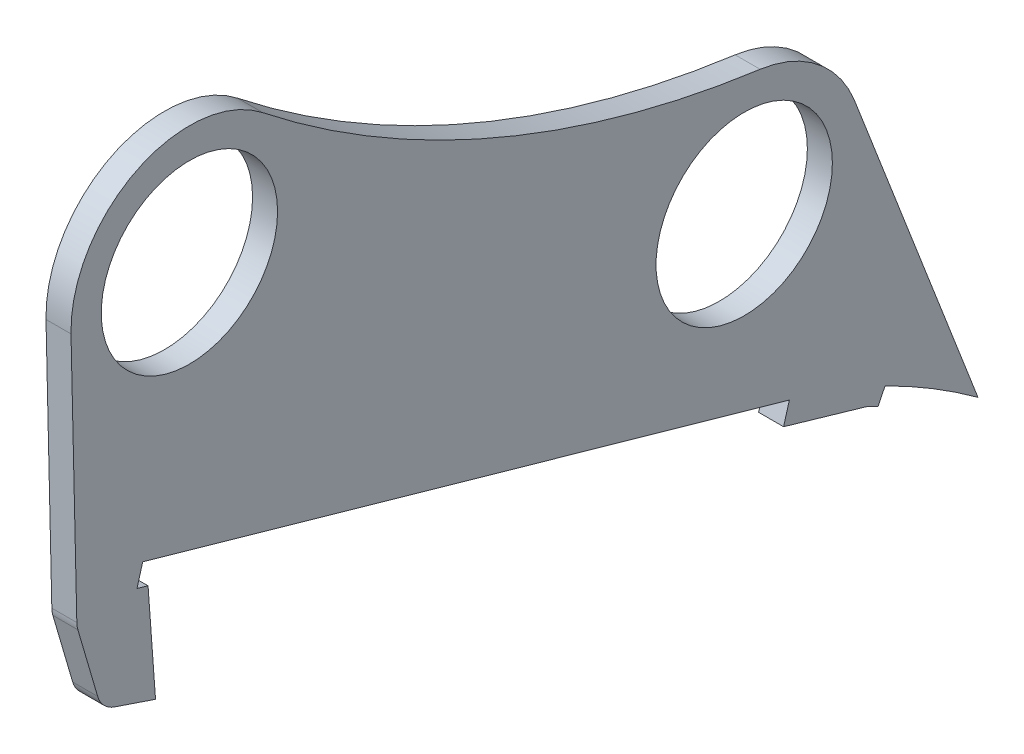
ISO-10303-21;
HEADER;
FILE_DESCRIPTION(('STEP AP214'),'2;1');
FILE_NAME('part.step','',(''),(''),'','','');
FILE_SCHEMA(('AUTOMOTIVE_DESIGN { 1 0 10303 214 1 1 1 1 }'));
ENDSEC;
DATA;
#1=APPLICATION_CONTEXT('core data for automotive mechanical design processes');
#2=APPLICATION_PROTOCOL_DEFINITION('international standard','automotive_design',2000,#1);
#3=PRODUCT_CONTEXT('',#1,'mechanical');
#4=PRODUCT('Part','Part','',(#3));
#5=PRODUCT_RELATED_PRODUCT_CATEGORY('part','',(#4));
#6=PRODUCT_DEFINITION_FORMATION('','',#4);
#7=PRODUCT_DEFINITION_CONTEXT('part definition',#1,'design');
#8=PRODUCT_DEFINITION('design','',#6,#7);
#9=PRODUCT_DEFINITION_SHAPE('','',#8);
#10=(LENGTH_UNIT() NAMED_UNIT(*) SI_UNIT(.MILLI.,.METRE.));
#11=(NAMED_UNIT(*) PLANE_ANGLE_UNIT() SI_UNIT($,.RADIAN.));
#12=(NAMED_UNIT(*) SI_UNIT($,.STERADIAN.) SOLID_ANGLE_UNIT());
#13=UNCERTAINTY_MEASURE_WITH_UNIT(LENGTH_MEASURE(1.E-05),#10,'distance_accuracy_value','');
#14=(GEOMETRIC_REPRESENTATION_CONTEXT(3) GLOBAL_UNCERTAINTY_ASSIGNED_CONTEXT((#13)) GLOBAL_UNIT_ASSIGNED_CONTEXT((#10,
#11,#12)) REPRESENTATION_CONTEXT('',''));
#15=CARTESIAN_POINT('',(0.,0.,0.));
#16=DIRECTION('',(0.,0.,1.));
#17=DIRECTION('',(1.,0.,0.));
#18=AXIS2_PLACEMENT_3D('',#15,#16,#17);
#19=CARTESIAN_POINT('',(-191.,906.438641209592,-119.844436372068));
#20=DIRECTION('',(0.,-0.947327251678291,0.320267198176234));
#21=DIRECTION('',(0.,-0.320267198176234,-0.947327251678291));
#22=AXIS2_PLACEMENT_3D('',#19,#20,#21);
#23=PLANE('',#22);
#24=DIRECTION('',(0.,-0.320267198176234,-0.947327251678291));
#25=VECTOR('',#24,1.);
#26=CARTESIAN_POINT('',(-210.,906.438641209592,-119.844436372068));
#27=LINE('',#26,#25);
#28=CARTESIAN_POINT('',(-210.,916.975114147196,-88.6783100650255));
#29=VERTEX_POINT('',#28);
#30=CARTESIAN_POINT('',(-210.,906.438641209592,-119.844436372068));
#31=VERTEX_POINT('',#30);
#32=EDGE_CURVE('E229',#29,#31,#27,.T.);
#33=ORIENTED_EDGE('',*,*,#32,.T.);
#34=DIRECTION('',(-1.,0.,0.));
#35=VECTOR('',#34,1.);
#36=CARTESIAN_POINT('',(-191.,906.438641209592,-119.844436372068));
#37=LINE('',#36,#35);
#38=CARTESIAN_POINT('',(-191.,906.438641209592,-119.844436372068));
#39=VERTEX_POINT('',#38);
#40=EDGE_CURVE('E195',#39,#31,#37,.T.);
#41=ORIENTED_EDGE('',*,*,#40,.F.);
#42=DIRECTION('',(0.,-0.320267198176234,-0.947327251678291));
#43=VECTOR('',#42,1.);
#44=CARTESIAN_POINT('',(-191.,906.438641209592,-119.844436372068));
#45=LINE('',#44,#43);
#46=CARTESIAN_POINT('',(-191.,916.975114147196,-88.6783100650255));
#47=VERTEX_POINT('',#46);
#48=EDGE_CURVE('E257',#47,#39,#45,.T.);
#49=ORIENTED_EDGE('',*,*,#48,.F.);
#50=DIRECTION('',(-1.,0.,0.));
#51=VECTOR('',#50,1.);
#52=CARTESIAN_POINT('',(-191.,916.975114147196,-88.6783100650255));
#53=LINE('',#52,#51);
#54=EDGE_CURVE('E204',#29,#47,#53,.F.);
#55=ORIENTED_EDGE('',*,*,#54,.F.);
#56=EDGE_LOOP('',(#33,#41,#49,#55));
#57=FACE_BOUND('',#56,.T.);
#58=ADVANCED_FACE('F37',(#57),#23,.T.);
#59=CARTESIAN_POINT('',(-191.,920.309525162057,-78.8153629987563));
#60=DIRECTION('',(0.,-0.281017058971093,0.959702773033004));
#61=DIRECTION('',(0.,-0.959702773033004,-0.281017058971093));
#62=AXIS2_PLACEMENT_3D('',#59,#60,#61);
#63=PLANE('',#62);
#64=DIRECTION('',(0.,-0.959702773033004,-0.281017058971093));
#65=VECTOR('',#64,1.);
#66=CARTESIAN_POINT('',(-191.,920.309525162057,-78.8153629987563));
#67=LINE('',#66,#65);
#68=CARTESIAN_POINT('',(-191.,981.661449624326,-60.8504911039759));
#69=VERTEX_POINT('',#68);
#70=CARTESIAN_POINT('',(-191.,930.30131800134,-75.8895985678901));
#71=VERTEX_POINT('',#70);
#72=EDGE_CURVE('E216',#69,#71,#67,.T.);
#73=ORIENTED_EDGE('',*,*,#72,.F.);
#74=DIRECTION('',(-1.,0.,0.));
#75=VECTOR('',#74,1.);
#76=CARTESIAN_POINT('',(-191.,981.661449624326,-60.8504911039759));
#77=LINE('',#76,#75);
#78=CARTESIAN_POINT('',(-210.,981.661449624326,-60.8504911039759));
#79=VERTEX_POINT('',#78);
#80=EDGE_CURVE('E186',#79,#69,#77,.F.);
#81=ORIENTED_EDGE('',*,*,#80,.F.);
#82=DIRECTION('',(0.,-0.959702773033004,-0.281017058971093));
#83=VECTOR('',#82,1.);
#84=CARTESIAN_POINT('',(-210.,920.309525162057,-78.8153629987563));
#85=LINE('',#84,#83);
#86=CARTESIAN_POINT('',(-210.,930.30131800134,-75.8895985678901));
#87=VERTEX_POINT('',#86);
#88=EDGE_CURVE('E217',#79,#87,#85,.T.);
#89=ORIENTED_EDGE('',*,*,#88,.T.);
#90=DIRECTION('',(-1.,0.,0.));
#91=VECTOR('',#90,1.);
#92=CARTESIAN_POINT('',(-191.,930.30131800134,-75.8895985678901));
#93=LINE('',#92,#91);
#94=EDGE_CURVE('E189',#71,#87,#93,.T.);
#95=ORIENTED_EDGE('',*,*,#94,.F.);
#96=EDGE_LOOP('',(#73,#81,#89,#95));
#97=FACE_BOUND('',#96,.T.);
#98=ADVANCED_FACE('F214',(#97),#63,.T.);
#99=CARTESIAN_POINT('',(-191.,984.188394964553,-60.1105591504117));
#100=DIRECTION('',(0.,-0.0230522795893329,0.999734260894231));
#101=DIRECTION('',(0.,-0.999734260894231,-0.0230522795893329));
#102=AXIS2_PLACEMENT_3D('',#99,#100,#101);
#103=PLANE('',#102);
#104=DIRECTION('',(0.,-0.999734260894231,-0.0230522795893329));
#105=VECTOR('',#104,1.);
#106=CARTESIAN_POINT('',(-191.,984.188394964553,-60.1105591504117));
#107=LINE('',#106,#105);
#108=CARTESIAN_POINT('',(-191.,1179.01810732901,-55.618096325623));
#109=VERTEX_POINT('',#108);
#110=CARTESIAN_POINT('',(-191.,986.820745211961,-60.0498613467513));
#111=VERTEX_POINT('',#110);
#112=EDGE_CURVE('E221',#109,#111,#107,.T.);
#113=ORIENTED_EDGE('',*,*,#112,.F.);
#114=DIRECTION('',(-1.,0.,0.));
#115=VECTOR('',#114,1.);
#116=CARTESIAN_POINT('',(-191.,1179.01810732901,-55.618096325623));
#117=LINE('',#116,#115);
#118=CARTESIAN_POINT('',(-210.,1179.01810732901,-55.618096325623));
#119=VERTEX_POINT('',#118);
#120=EDGE_CURVE('E187',#109,#119,#117,.T.);
#121=ORIENTED_EDGE('',*,*,#120,.T.);
#122=DIRECTION('',(0.,-0.999734260894231,-0.0230522795893329));
#123=VECTOR('',#122,1.);
#124=CARTESIAN_POINT('',(-210.,984.188394964553,-60.1105591504117));
#125=LINE('',#124,#123);
#126=CARTESIAN_POINT('',(-210.,986.820745211961,-60.0498613467513));
#127=VERTEX_POINT('',#126);
#128=EDGE_CURVE('E254',#119,#127,#125,.T.);
#129=ORIENTED_EDGE('',*,*,#128,.T.);
#130=DIRECTION('',(-1.,0.,0.));
#131=VECTOR('',#130,1.);
#132=CARTESIAN_POINT('',(-191.,986.820745211961,-60.0498613467513));
#133=LINE('',#132,#131);
#134=EDGE_CURVE('E11',#111,#127,#133,.T.);
#135=ORIENTED_EDGE('',*,*,#134,.F.);
#136=EDGE_LOOP('',(#113,#121,#129,#135));
#137=FACE_BOUND('',#136,.T.);
#138=ADVANCED_FACE('F331',(#137),#103,.T.);
#139=CARTESIAN_POINT('',(-191.,1181.09281249205,-145.594179806104));
#140=DIRECTION('',(-1.,0.,0.));
#141=DIRECTION('',(0.,0.,-1.));
#142=AXIS2_PLACEMENT_3D('',#139,#140,#141);
#143=CYLINDRICAL_SURFACE('',#142,90.0000000000002);
#144=CARTESIAN_POINT('',(-210.,1181.09281249205,-145.594179806104));
#145=DIRECTION('',(1.,0.,0.));
#146=DIRECTION('',(0.,0.,1.));
#147=AXIS2_PLACEMENT_3D('',#144,#145,#146);
#148=CIRCLE('',#147,90.0000000000002);
#149=CARTESIAN_POINT('',(-210.,1251.75226940095,-201.336812945738));
#150=VERTEX_POINT('',#149);
#151=EDGE_CURVE('E252',#150,#119,#148,.T.);
#152=ORIENTED_EDGE('',*,*,#151,.T.);
#153=ORIENTED_EDGE('',*,*,#120,.F.);
#154=CARTESIAN_POINT('',(-191.,1181.09281249205,-145.594179806104));
#155=DIRECTION('',(1.,0.,0.));
#156=DIRECTION('',(0.,0.,1.));
#157=AXIS2_PLACEMENT_3D('',#154,#155,#156);
#158=CIRCLE('',#157,90.0000000000002);
#159=CARTESIAN_POINT('',(-191.,1251.75226940095,-201.336812945738));
#160=VERTEX_POINT('',#159);
#161=EDGE_CURVE('E225',#160,#109,#158,.T.);
#162=ORIENTED_EDGE('',*,*,#161,.F.);
#163=DIRECTION('',(-1.,0.,0.));
#164=VECTOR('',#163,1.);
#165=CARTESIAN_POINT('',(-191.,1251.75226940095,-201.336812945738));
#166=LINE('',#165,#164);
#167=EDGE_CURVE('E192',#160,#150,#166,.T.);
#168=ORIENTED_EDGE('',*,*,#167,.T.);
#169=EDGE_LOOP('',(#152,#153,#162,#168));
#170=FACE_BOUND('',#169,.T.);
#171=ADVANCED_FACE('F327',(#170),#143,.T.);
#172=CARTESIAN_POINT('',(-191.,1863.76364397971,-684.147281959295));
#173=DIRECTION('',(-1.,0.,0.));
#174=DIRECTION('',(0.,0.,-1.));
#175=AXIS2_PLACEMENT_3D('',#172,#173,#174);
#176=CYLINDRICAL_SURFACE('',#175,779.52798);
#177=CARTESIAN_POINT('',(-210.,1863.76364397971,-684.147281959295));
#178=DIRECTION('',(-1.,0.,0.));
#179=DIRECTION('',(0.,0.,1.));
#180=AXIS2_PLACEMENT_3D('',#177,#178,#179);
#181=CIRCLE('',#180,779.52798);
#182=CARTESIAN_POINT('',(-210.,1091.32003343083,-579.291475610333));
#183=VERTEX_POINT('',#182);
#184=EDGE_CURVE('E250',#183,#150,#181,.T.);
#185=ORIENTED_EDGE('',*,*,#184,.T.);
#186=ORIENTED_EDGE('',*,*,#167,.F.);
#187=CARTESIAN_POINT('',(-191.,1863.76364397971,-684.147281959295));
#188=DIRECTION('',(-1.,0.,0.));
#189=DIRECTION('',(0.,0.,1.));
#190=AXIS2_PLACEMENT_3D('',#187,#188,#189);
#191=CIRCLE('',#190,779.52798);
#192=CARTESIAN_POINT('',(-191.,1091.32003343083,-579.291475610333));
#193=VERTEX_POINT('',#192);
#194=EDGE_CURVE('E320',#193,#160,#191,.T.);
#195=ORIENTED_EDGE('',*,*,#194,.F.);
#196=DIRECTION('',(-1.,0.,0.));
#197=VECTOR('',#196,1.);
#198=CARTESIAN_POINT('',(-191.,1091.32003343083,-579.291475610333));
#199=LINE('',#198,#197);
#200=EDGE_CURVE('E261',#193,#183,#199,.T.);
#201=ORIENTED_EDGE('',*,*,#200,.T.);
#202=EDGE_LOOP('',(#185,#186,#195,#201));
#203=FACE_BOUND('',#202,.T.);
#204=ADVANCED_FACE('F381',(#203),#176,.F.);
#205=CARTESIAN_POINT('',(-191.,1002.13795564397,-567.185402687323));
#206=DIRECTION('',(-1.,0.,0.));
#207=DIRECTION('',(0.,0.,-1.));
#208=AXIS2_PLACEMENT_3D('',#205,#206,#207);
#209=CYLINDRICAL_SURFACE('',#208,90.);
#210=CARTESIAN_POINT('',(-210.,1002.13795564397,-567.185402687323));
#211=DIRECTION('',(1.,0.,0.));
#212=DIRECTION('',(0.,0.,1.));
#213=AXIS2_PLACEMENT_3D('',#210,#211,#212);
#214=CIRCLE('',#213,90.);
#215=CARTESIAN_POINT('',(-210.,1034.64226360609,-651.110785998354));
#216=VERTEX_POINT('',#215);
#217=EDGE_CURVE('E248',#216,#183,#214,.T.);
#218=ORIENTED_EDGE('',*,*,#217,.T.);
#219=ORIENTED_EDGE('',*,*,#200,.F.);
#220=CARTESIAN_POINT('',(-191.,1002.13795564397,-567.185402687323));
#221=DIRECTION('',(1.,0.,0.));
#222=DIRECTION('',(0.,0.,1.));
#223=AXIS2_PLACEMENT_3D('',#220,#221,#222);
#224=CIRCLE('',#223,90.);
#225=CARTESIAN_POINT('',(-191.,1034.64226360609,-651.110785998354));
#226=VERTEX_POINT('',#225);
#227=EDGE_CURVE('E318',#226,#193,#224,.T.);
#228=ORIENTED_EDGE('',*,*,#227,.F.);
#229=DIRECTION('',(-1.,0.,0.));
#230=VECTOR('',#229,1.);
#231=CARTESIAN_POINT('',(-191.,1034.64226360609,-651.110785998354));
#232=LINE('',#231,#230);
#233=EDGE_CURVE('E264',#226,#216,#232,.T.);
#234=ORIENTED_EDGE('',*,*,#233,.T.);
#235=EDGE_LOOP('',(#218,#219,#228,#234));
#236=FACE_BOUND('',#235,.T.);
#237=ADVANCED_FACE('F384',(#236),#209,.T.);
#238=CARTESIAN_POINT('',(-191.,1034.64226360609,-651.110785998354));
#239=DIRECTION('',(0.,0.361158977356921,-0.932504259011455));
#240=DIRECTION('',(0.,0.932504259011455,0.361158977356921));
#241=AXIS2_PLACEMENT_3D('',#238,#239,#240);
#242=PLANE('',#241);
#243=DIRECTION('',(-1.,0.,0.));
#244=VECTOR('',#243,1.);
#245=CARTESIAN_POINT('',(472.5,792.632819585877,-744.841063869378));
#246=LINE('',#245,#244);
#247=CARTESIAN_POINT('',(-191.,792.632819585877,-744.841063869378));
#248=VERTEX_POINT('',#247);
#249=CARTESIAN_POINT('',(-210.,792.632819585877,-744.841063869378));
#250=VERTEX_POINT('',#249);
#251=EDGE_CURVE('E576',#248,#250,#246,.T.);
#252=ORIENTED_EDGE('',*,*,#251,.T.);
#253=DIRECTION('',(0.,0.932504259011455,0.361158977356921));
#254=VECTOR('',#253,1.);
#255=CARTESIAN_POINT('',(-210.,1034.64226360609,-651.110785998354));
#256=LINE('',#255,#254);
#257=EDGE_CURVE('E184',#250,#216,#256,.T.);
#258=ORIENTED_EDGE('',*,*,#257,.T.);
#259=ORIENTED_EDGE('',*,*,#233,.F.);
#260=DIRECTION('',(0.,0.932504259011455,0.361158977356921));
#261=VECTOR('',#260,1.);
#262=CARTESIAN_POINT('',(-191.,1034.64226360609,-651.110785998354));
#263=LINE('',#262,#261);
#264=EDGE_CURVE('E316',#248,#226,#263,.T.);
#265=ORIENTED_EDGE('',*,*,#264,.F.);
#266=EDGE_LOOP('',(#252,#258,#259,#265));
#267=FACE_BOUND('',#266,.T.);
#268=ADVANCED_FACE('F388',(#267),#242,.T.);
#269=CARTESIAN_POINT('',(-191.,405.294924155163,-461.479390821886));
#270=DIRECTION('',(-1.,0.,0.));
#271=DIRECTION('',(0.,0.,-1.));
#272=AXIS2_PLACEMENT_3D('',#269,#270,#271);
#273=CYLINDRICAL_SURFACE('',#272,467.92133);
#274=DIRECTION('',(-1.,0.,0.));
#275=VECTOR('',#274,1.);
#276=CARTESIAN_POINT('',(472.5,824.728307462711,-668.906505819304));
#277=LINE('',#276,#275);
#278=CARTESIAN_POINT('',(-191.,824.728307462711,-668.906505819304));
#279=VERTEX_POINT('',#278);
#280=CARTESIAN_POINT('',(-210.,824.728307462711,-668.906505819304));
#281=VERTEX_POINT('',#280);
#282=EDGE_CURVE('E171',#279,#281,#277,.T.);
#283=ORIENTED_EDGE('',*,*,#282,.F.);
#284=CARTESIAN_POINT('',(-191.,405.294924155163,-461.479390821886));
#285=DIRECTION('',(-1.,0.,0.));
#286=DIRECTION('',(0.,0.,-1.));
#287=AXIS2_PLACEMENT_3D('',#284,#285,#286);
#288=CIRCLE('',#287,467.92133);
#289=CARTESIAN_POINT('',(-191.,828.697043238749,-660.680336162257));
#290=VERTEX_POINT('',#289);
#291=EDGE_CURVE('E313',#290,#279,#288,.T.);
#292=ORIENTED_EDGE('',*,*,#291,.F.);
#293=DIRECTION('',(-1.,0.,0.));
#294=VECTOR('',#293,1.);
#295=CARTESIAN_POINT('',(-191.,828.697043238749,-660.680336162257));
#296=LINE('',#295,#294);
#297=CARTESIAN_POINT('',(-210.,828.697043238749,-660.680336162257));
#298=VERTEX_POINT('',#297);
#299=EDGE_CURVE('E267',#290,#298,#296,.T.);
#300=ORIENTED_EDGE('',*,*,#299,.T.);
#301=CARTESIAN_POINT('',(-210.,405.294924155163,-461.479390821886));
#302=DIRECTION('',(-1.,0.,0.));
#303=DIRECTION('',(0.,0.,-1.));
#304=AXIS2_PLACEMENT_3D('',#301,#302,#303);
#305=CIRCLE('',#304,467.92133);
#306=EDGE_CURVE('E245',#298,#281,#305,.T.);
#307=ORIENTED_EDGE('',*,*,#306,.T.);
#308=EDGE_LOOP('',(#283,#292,#300,#307));
#309=FACE_BOUND('',#308,.T.);
#310=ADVANCED_FACE('F392',(#309),#273,.F.);
#311=CARTESIAN_POINT('',(-191.,847.162491093384,-597.115537575845));
#312=DIRECTION('',(0.,-0.960301105499305,0.278965565575418));
#313=DIRECTION('',(0.,-0.278965565575418,-0.960301105499305));
#314=AXIS2_PLACEMENT_3D('',#311,#312,#313);
#315=PLANE('',#314);
#316=DIRECTION('',(0.,-0.278965565575418,-0.960301105499305));
#317=VECTOR('',#316,1.);
#318=CARTESIAN_POINT('',(-210.,847.162491093384,-597.115537575845));
#319=LINE('',#318,#317);
#320=CARTESIAN_POINT('',(-210.,847.162491093384,-597.115537575845));
#321=VERTEX_POINT('',#320);
#322=EDGE_CURVE('E243',#321,#298,#319,.T.);
#323=ORIENTED_EDGE('',*,*,#322,.T.);
#324=ORIENTED_EDGE('',*,*,#299,.F.);
#325=DIRECTION('',(0.,-0.278965565575418,-0.960301105499305));
#326=VECTOR('',#325,1.);
#327=CARTESIAN_POINT('',(-191.,847.162491093384,-597.115537575845));
#328=LINE('',#327,#326);
#329=CARTESIAN_POINT('',(-191.,847.162491093384,-597.115537575845));
#330=VERTEX_POINT('',#329);
#331=EDGE_CURVE('E307',#330,#290,#328,.T.);
#332=ORIENTED_EDGE('',*,*,#331,.F.);
#333=DIRECTION('',(-1.,0.,0.));
#334=VECTOR('',#333,1.);
#335=CARTESIAN_POINT('',(-191.,847.162491093384,-597.115537575845));
#336=LINE('',#335,#334);
#337=EDGE_CURVE('E270',#330,#321,#336,.T.);
#338=ORIENTED_EDGE('',*,*,#337,.T.);
#339=EDGE_LOOP('',(#323,#324,#332,#338));
#340=FACE_BOUND('',#339,.T.);
#341=ADVANCED_FACE('F396',(#340),#315,.T.);
#342=CARTESIAN_POINT('',(-191.,862.556716449971,-601.47648078467));
#343=DIRECTION('',(0.,0.272558950551546,0.962139084786727));
#344=DIRECTION('',(0.,-0.962139084786727,0.272558950551546));
#345=AXIS2_PLACEMENT_3D('',#342,#343,#344);
#346=PLANE('',#345);
#347=DIRECTION('',(0.,-0.962139084786727,0.272558950551546));
#348=VECTOR('',#347,1.);
#349=CARTESIAN_POINT('',(-210.,862.556716449971,-601.47648078467));
#350=LINE('',#349,#348);
#351=CARTESIAN_POINT('',(-210.,862.556716449971,-601.47648078467));
#352=VERTEX_POINT('',#351);
#353=EDGE_CURVE('E241',#352,#321,#350,.T.);
#354=ORIENTED_EDGE('',*,*,#353,.T.);
#355=ORIENTED_EDGE('',*,*,#337,.F.);
#356=DIRECTION('',(0.,-0.962139084786727,0.272558950551546));
#357=VECTOR('',#356,1.);
#358=CARTESIAN_POINT('',(-191.,862.556716449971,-601.47648078467));
#359=LINE('',#358,#357);
#360=CARTESIAN_POINT('',(-191.,862.556716449971,-601.47648078467));
#361=VERTEX_POINT('',#360);
#362=EDGE_CURVE('E304',#361,#330,#359,.T.);
#363=ORIENTED_EDGE('',*,*,#362,.F.);
#364=DIRECTION('',(-1.,0.,0.));
#365=VECTOR('',#364,1.);
#366=CARTESIAN_POINT('',(-191.,862.556716449971,-601.47648078467));
#367=LINE('',#366,#365);
#368=EDGE_CURVE('E273',#361,#352,#367,.T.);
#369=ORIENTED_EDGE('',*,*,#368,.T.);
#370=EDGE_LOOP('',(#354,#355,#363,#369));
#371=FACE_BOUND('',#370,.T.);
#372=ADVANCED_FACE('F400',(#371),#346,.T.);
#373=CARTESIAN_POINT('',(-191.,862.556716449971,-601.47648078467));
#374=DIRECTION('',(0.,-0.962139084786726,0.272558950551548));
#375=DIRECTION('',(0.,-0.272558950551548,-0.962139084786726));
#376=AXIS2_PLACEMENT_3D('',#373,#374,#375);
#377=PLANE('',#376);
#378=DIRECTION('',(0.,-0.272558950551548,-0.962139084786726));
#379=VECTOR('',#378,1.);
#380=CARTESIAN_POINT('',(-210.,862.556716449971,-601.47648078467));
#381=LINE('',#380,#379);
#382=CARTESIAN_POINT('',(-210.,1001.75299488316,-110.110559150412));
#383=VERTEX_POINT('',#382);
#384=EDGE_CURVE('E239',#383,#352,#381,.T.);
#385=ORIENTED_EDGE('',*,*,#384,.T.);
#386=ORIENTED_EDGE('',*,*,#368,.F.);
#387=DIRECTION('',(0.,-0.272558950551548,-0.962139084786726));
#388=VECTOR('',#387,1.);
#389=CARTESIAN_POINT('',(-191.,862.556716449971,-601.47648078467));
#390=LINE('',#389,#388);
#391=CARTESIAN_POINT('',(-191.,1001.75299488316,-110.110559150412));
#392=VERTEX_POINT('',#391);
#393=EDGE_CURVE('E302',#392,#361,#390,.T.);
#394=ORIENTED_EDGE('',*,*,#393,.F.);
#395=DIRECTION('',(-1.,0.,0.));
#396=VECTOR('',#395,1.);
#397=CARTESIAN_POINT('',(-191.,1001.75299488316,-110.110559150412));
#398=LINE('',#397,#396);
#399=EDGE_CURVE('E276',#392,#383,#398,.T.);
#400=ORIENTED_EDGE('',*,*,#399,.T.);
#401=EDGE_LOOP('',(#385,#386,#394,#400));
#402=FACE_BOUND('',#401,.T.);
#403=ADVANCED_FACE('F300',(#402),#377,.T.);
#404=CARTESIAN_POINT('',(-191.,1001.75299488316,-110.110559150412));
#405=DIRECTION('',(0.,-0.272558950551558,-0.962139084786723));
#406=DIRECTION('',(0.,0.962139084786723,-0.272558950551558));
#407=AXIS2_PLACEMENT_3D('',#404,#405,#406);
#408=PLANE('',#407);
#409=DIRECTION('',(0.,0.962139084786723,-0.272558950551558));
#410=VECTOR('',#409,1.);
#411=CARTESIAN_POINT('',(-210.,1001.75299488316,-110.110559150412));
#412=LINE('',#411,#410);
#413=CARTESIAN_POINT('',(-210.,986.358769526574,-105.749615941587));
#414=VERTEX_POINT('',#413);
#415=EDGE_CURVE('E237',#414,#383,#412,.T.);
#416=ORIENTED_EDGE('',*,*,#415,.T.);
#417=ORIENTED_EDGE('',*,*,#399,.F.);
#418=DIRECTION('',(0.,0.962139084786723,-0.272558950551558));
#419=VECTOR('',#418,1.);
#420=CARTESIAN_POINT('',(-191.,1001.75299488316,-110.110559150412));
#421=LINE('',#420,#419);
#422=CARTESIAN_POINT('',(-191.,986.358769526574,-105.749615941587));
#423=VERTEX_POINT('',#422);
#424=EDGE_CURVE('E305',#423,#392,#421,.T.);
#425=ORIENTED_EDGE('',*,*,#424,.F.);
#426=DIRECTION('',(-1.,0.,0.));
#427=VECTOR('',#426,1.);
#428=CARTESIAN_POINT('',(-191.,986.358769526574,-105.749615941587));
#429=LINE('',#428,#427);
#430=EDGE_CURVE('E279',#423,#414,#429,.T.);
#431=ORIENTED_EDGE('',*,*,#430,.T.);
#432=EDGE_LOOP('',(#416,#417,#425,#431));
#433=FACE_BOUND('',#432,.T.);
#434=ADVANCED_FACE('F296',(#433),#408,.T.);
#435=CARTESIAN_POINT('',(-191.,986.358769526574,-105.749615941587));
#436=DIRECTION('',(0.,0.962139084786728,-0.27255895055154));
#437=DIRECTION('',(0.,0.27255895055154,0.962139084786728));
#438=AXIS2_PLACEMENT_3D('',#435,#436,#437);
#439=PLANE('',#438);
#440=DIRECTION('',(0.,0.27255895055154,0.962139084786728));
#441=VECTOR('',#440,1.);
#442=CARTESIAN_POINT('',(-210.,986.358769526574,-105.749615941587));
#443=LINE('',#442,#441);
#444=CARTESIAN_POINT('',(-210.,983.972475444098,-114.173286490289));
#445=VERTEX_POINT('',#444);
#446=EDGE_CURVE('E235',#445,#414,#443,.T.);
#447=ORIENTED_EDGE('',*,*,#446,.T.);
#448=ORIENTED_EDGE('',*,*,#430,.F.);
#449=DIRECTION('',(0.,0.27255895055154,0.962139084786728));
#450=VECTOR('',#449,1.);
#451=CARTESIAN_POINT('',(-191.,986.358769526574,-105.749615941587));
#452=LINE('',#451,#450);
#453=CARTESIAN_POINT('',(-191.,983.972475444098,-114.173286490289));
#454=VERTEX_POINT('',#453);
#455=EDGE_CURVE('E288',#454,#423,#452,.T.);
#456=ORIENTED_EDGE('',*,*,#455,.F.);
#457=DIRECTION('',(-1.,0.,0.));
#458=VECTOR('',#457,1.);
#459=CARTESIAN_POINT('',(-191.,983.972475444098,-114.173286490289));
#460=LINE('',#459,#458);
#461=EDGE_CURVE('E224',#454,#445,#460,.T.);
#462=ORIENTED_EDGE('',*,*,#461,.T.);
#463=EDGE_LOOP('',(#447,#448,#456,#462));
#464=FACE_BOUND('',#463,.T.);
#465=ADVANCED_FACE('F286',(#464),#439,.T.);
#466=CARTESIAN_POINT('',(-191.,983.972475444098,-114.173286490289));
#467=DIRECTION('',(0.,0.0729493131155386,-0.997335649476129));
#468=DIRECTION('',(0.,0.997335649476129,0.0729493131155386));
#469=AXIS2_PLACEMENT_3D('',#466,#467,#468);
#470=PLANE('',#469);
#471=DIRECTION('',(0.,0.997335649476129,0.0729493131155386));
#472=VECTOR('',#471,1.);
#473=CARTESIAN_POINT('',(-210.,983.972475444098,-114.173286490289));
#474=LINE('',#473,#472);
#475=EDGE_CURVE('E232',#31,#445,#474,.T.);
#476=ORIENTED_EDGE('',*,*,#475,.T.);
#477=ORIENTED_EDGE('',*,*,#461,.F.);
#478=DIRECTION('',(0.,0.997335649476129,0.0729493131155386));
#479=VECTOR('',#478,1.);
#480=CARTESIAN_POINT('',(-191.,983.972475444098,-114.173286490289));
#481=LINE('',#480,#479);
#482=EDGE_CURVE('E334',#39,#454,#481,.T.);
#483=ORIENTED_EDGE('',*,*,#482,.F.);
#484=ORIENTED_EDGE('',*,*,#40,.T.);
#485=EDGE_LOOP('',(#476,#477,#483,#484));
#486=FACE_BOUND('',#485,.T.);
#487=ADVANCED_FACE('F340',(#486),#470,.T.);
#488=CARTESIAN_POINT('',(-191.,1181.09281249205,-145.594179806104));
#489=DIRECTION('',(1.,0.,0.));
#490=DIRECTION('',(0.,0.,1.));
#491=AXIS2_PLACEMENT_3D('',#488,#489,#490);
#492=PLANE('',#491);
#493=ORIENTED_EDGE('',*,*,#48,.T.);
#494=ORIENTED_EDGE('',*,*,#482,.T.);
#495=ORIENTED_EDGE('',*,*,#455,.T.);
#496=ORIENTED_EDGE('',*,*,#424,.T.);
#497=ORIENTED_EDGE('',*,*,#393,.T.);
#498=ORIENTED_EDGE('',*,*,#362,.T.);
#499=ORIENTED_EDGE('',*,*,#331,.T.);
#500=ORIENTED_EDGE('',*,*,#291,.T.);
#501=DIRECTION('',(0.,0.896375857256918,-0.443294848297299));
#502=VECTOR('',#501,1.);
#503=CARTESIAN_POINT('',(-191.,903.120750959665,-707.674803812047));
#504=LINE('',#503,#502);
#505=CARTESIAN_POINT('',(-191.,835.484817749794,-674.226043998872));
#506=VERTEX_POINT('',#505);
#507=EDGE_CURVE('E573',#279,#506,#504,.T.);
#508=ORIENTED_EDGE('',*,*,#507,.T.);
#509=CARTESIAN_POINT('',(-191.,405.294924155163,-461.479390821886));
#510=DIRECTION('',(-1.,0.,0.));
#511=DIRECTION('',(0.,0.,1.));
#512=AXIS2_PLACEMENT_3D('',#509,#510,#511);
#513=CIRCLE('',#512,479.92133);
#514=EDGE_CURVE('E168',#506,#248,#513,.T.);
#515=ORIENTED_EDGE('',*,*,#514,.T.);
#516=ORIENTED_EDGE('',*,*,#264,.T.);
#517=ORIENTED_EDGE('',*,*,#227,.T.);
#518=ORIENTED_EDGE('',*,*,#194,.T.);
#519=ORIENTED_EDGE('',*,*,#161,.T.);
#520=ORIENTED_EDGE('',*,*,#112,.T.);
#521=CARTESIAN_POINT('',(-191.,987.281790803748,-80.044546564636));
#522=DIRECTION('',(-1.,0.,0.));
#523=DIRECTION('',(0.,0.,1.));
#524=AXIS2_PLACEMENT_3D('',#521,#522,#523);
#525=CIRCLE('',#524,20.);
#526=EDGE_CURVE('E51',#69,#111,#525,.T.);
#527=ORIENTED_EDGE('',*,*,#526,.F.);
#528=ORIENTED_EDGE('',*,*,#72,.T.);
#529=CARTESIAN_POINT('',(-191.,935.921659180761,-95.0836540285502));
#530=DIRECTION('',(-1.,0.,0.));
#531=DIRECTION('',(0.,0.,1.));
#532=AXIS2_PLACEMENT_3D('',#529,#530,#531);
#533=CIRCLE('',#532,20.);
#534=EDGE_CURVE('E45',#47,#71,#533,.T.);
#535=ORIENTED_EDGE('',*,*,#534,.F.);
#536=EDGE_LOOP('',(#493,#494,#495,#496,#497,#498,#499,#500,#508,#515,#516,#517,#518,#519,#520,
#527,#528,#535));
#537=FACE_BOUND('',#536,.T.);
#538=CARTESIAN_POINT('',(-191.,1002.13795564397,-567.185402687323));
#539=DIRECTION('',(1.,0.,0.));
#540=DIRECTION('',(0.,0.,-1.));
#541=AXIS2_PLACEMENT_3D('',#538,#539,#540);
#542=CIRCLE('',#541,66.9999999999999);
#543=CARTESIAN_POINT('',(-191.,1002.13795564397,-634.185402687323));
#544=VERTEX_POINT('',#543);
#545=EDGE_CURVE('E579',#544,#544,#542,.T.);
#546=ORIENTED_EDGE('',*,*,#545,.F.);
#547=EDGE_LOOP('',(#546));
#548=FACE_BOUND('',#547,.T.);
#549=CARTESIAN_POINT('',(-191.,1181.09281249205,-145.594179806104));
#550=DIRECTION('',(1.,0.,0.));
#551=DIRECTION('',(0.,0.,-1.));
#552=AXIS2_PLACEMENT_3D('',#549,#550,#551);
#553=CIRCLE('',#552,67.0000000000001);
#554=CARTESIAN_POINT('',(-191.,1181.09281249205,-212.594179806104));
#555=VERTEX_POINT('',#554);
#556=EDGE_CURVE('E233',#555,#555,#553,.T.);
#557=ORIENTED_EDGE('',*,*,#556,.F.);
#558=EDGE_LOOP('',(#557));
#559=FACE_BOUND('',#558,.T.);
#560=ADVANCED_FACE('F218',(#537,#548,#559),#492,.T.);
#561=CARTESIAN_POINT('',(-210.,1181.09281249205,-145.594179806104));
#562=DIRECTION('',(1.,0.,0.));
#563=DIRECTION('',(0.,0.,1.));
#564=AXIS2_PLACEMENT_3D('',#561,#562,#563);
#565=PLANE('',#564);
#566=CARTESIAN_POINT('',(-210.,1002.13795564397,-567.185402687323));
#567=DIRECTION('',(1.,0.,0.));
#568=DIRECTION('',(0.,0.,-1.));
#569=AXIS2_PLACEMENT_3D('',#566,#567,#568);
#570=CIRCLE('',#569,66.9999999999999);
#571=CARTESIAN_POINT('',(-210.,1002.13795564397,-634.185402687323));
#572=VERTEX_POINT('',#571);
#573=EDGE_CURVE('E575',#572,#572,#570,.T.);
#574=ORIENTED_EDGE('',*,*,#573,.T.);
#575=EDGE_LOOP('',(#574));
#576=FACE_BOUND('',#575,.T.);
#577=CARTESIAN_POINT('',(-210.,1181.09281249205,-145.594179806104));
#578=DIRECTION('',(1.,0.,0.));
#579=DIRECTION('',(0.,0.,-1.));
#580=AXIS2_PLACEMENT_3D('',#577,#578,#579);
#581=CIRCLE('',#580,67.0000000000001);
#582=CARTESIAN_POINT('',(-210.,1181.09281249205,-212.594179806104));
#583=VERTEX_POINT('',#582);
#584=EDGE_CURVE('E338',#583,#583,#581,.T.);
#585=ORIENTED_EDGE('',*,*,#584,.T.);
#586=EDGE_LOOP('',(#585));
#587=FACE_BOUND('',#586,.T.);
#588=ORIENTED_EDGE('',*,*,#88,.F.);
#589=CARTESIAN_POINT('',(-210.,987.281790803748,-80.044546564636));
#590=DIRECTION('',(-1.,0.,0.));
#591=DIRECTION('',(0.,0.,1.));
#592=AXIS2_PLACEMENT_3D('',#589,#590,#591);
#593=CIRCLE('',#592,20.);
#594=EDGE_CURVE('E200',#127,#79,#593,.F.);
#595=ORIENTED_EDGE('',*,*,#594,.F.);
#596=ORIENTED_EDGE('',*,*,#128,.F.);
#597=ORIENTED_EDGE('',*,*,#151,.F.);
#598=ORIENTED_EDGE('',*,*,#184,.F.);
#599=ORIENTED_EDGE('',*,*,#217,.F.);
#600=ORIENTED_EDGE('',*,*,#257,.F.);
#601=CARTESIAN_POINT('',(-210.,405.294924155163,-461.479390821886));
#602=DIRECTION('',(-1.,0.,0.));
#603=DIRECTION('',(0.,0.,1.));
#604=AXIS2_PLACEMENT_3D('',#601,#602,#603);
#605=CIRCLE('',#604,479.92133);
#606=CARTESIAN_POINT('',(-210.,835.484817749794,-674.226043998872));
#607=VERTEX_POINT('',#606);
#608=EDGE_CURVE('E166',#607,#250,#605,.T.);
#609=ORIENTED_EDGE('',*,*,#608,.F.);
#610=DIRECTION('',(0.,-0.896375857256918,0.443294848297299));
#611=VECTOR('',#610,1.);
#612=CARTESIAN_POINT('',(-210.,824.728307462711,-668.906505819304));
#613=LINE('',#612,#611);
#614=EDGE_CURVE('E172',#607,#281,#613,.T.);
#615=ORIENTED_EDGE('',*,*,#614,.T.);
#616=ORIENTED_EDGE('',*,*,#306,.F.);
#617=ORIENTED_EDGE('',*,*,#322,.F.);
#618=ORIENTED_EDGE('',*,*,#353,.F.);
#619=ORIENTED_EDGE('',*,*,#384,.F.);
#620=ORIENTED_EDGE('',*,*,#415,.F.);
#621=ORIENTED_EDGE('',*,*,#446,.F.);
#622=ORIENTED_EDGE('',*,*,#475,.F.);
#623=ORIENTED_EDGE('',*,*,#32,.F.);
#624=CARTESIAN_POINT('',(-210.,935.921659180761,-95.0836540285502));
#625=DIRECTION('',(-1.,0.,0.));
#626=DIRECTION('',(0.,0.,1.));
#627=AXIS2_PLACEMENT_3D('',#624,#625,#626);
#628=CIRCLE('',#627,20.);
#629=EDGE_CURVE('E202',#87,#29,#628,.F.);
#630=ORIENTED_EDGE('',*,*,#629,.F.);
#631=EDGE_LOOP('',(#588,#595,#596,#597,#598,#599,#600,#609,#615,#616,#617,#618,#619,#620,#621,
#622,#623,#630));
#632=FACE_BOUND('',#631,.T.);
#633=ADVANCED_FACE('F182',(#576,#587,#632),#565,.F.);
#634=CARTESIAN_POINT('',(-191.,1181.09281249205,-145.594179806104));
#635=DIRECTION('',(-1.,0.,0.));
#636=DIRECTION('',(0.,0.,-1.));
#637=AXIS2_PLACEMENT_3D('',#634,#635,#636);
#638=CYLINDRICAL_SURFACE('',#637,67.0000000000001);
#639=ORIENTED_EDGE('',*,*,#556,.T.);
#640=EDGE_LOOP('',(#639));
#641=FACE_BOUND('',#640,.T.);
#642=ORIENTED_EDGE('',*,*,#584,.F.);
#643=EDGE_LOOP('',(#642));
#644=FACE_BOUND('',#643,.T.);
#645=ADVANCED_FACE('F369',(#641,#644),#638,.F.);
#646=CARTESIAN_POINT('',(-191.,1002.13795564397,-567.185402687323));
#647=DIRECTION('',(-1.,0.,0.));
#648=DIRECTION('',(0.,0.,-1.));
#649=AXIS2_PLACEMENT_3D('',#646,#647,#648);
#650=CYLINDRICAL_SURFACE('',#649,66.9999999999999);
#651=ORIENTED_EDGE('',*,*,#545,.T.);
#652=EDGE_LOOP('',(#651));
#653=FACE_BOUND('',#652,.T.);
#654=ORIENTED_EDGE('',*,*,#573,.F.);
#655=EDGE_LOOP('',(#654));
#656=FACE_BOUND('',#655,.T.);
#657=ADVANCED_FACE('F364',(#653,#656),#650,.F.);
#658=CARTESIAN_POINT('',(472.5,824.728307462711,-668.906505819304));
#659=DIRECTION('',(0.,0.443294848297299,0.896375857256918));
#660=DIRECTION('',(0.,-0.896375857256918,0.443294848297299));
#661=AXIS2_PLACEMENT_3D('',#658,#659,#660);
#662=PLANE('',#661);
#663=ORIENTED_EDGE('',*,*,#507,.F.);
#664=ORIENTED_EDGE('',*,*,#282,.T.);
#665=ORIENTED_EDGE('',*,*,#614,.F.);
#666=DIRECTION('',(-1.,0.,0.));
#667=VECTOR('',#666,1.);
#668=CARTESIAN_POINT('',(472.5,835.484817749794,-674.226043998872));
#669=LINE('',#668,#667);
#670=EDGE_CURVE('E161',#506,#607,#669,.T.);
#671=ORIENTED_EDGE('',*,*,#670,.F.);
#672=EDGE_LOOP('',(#663,#664,#665,#671));
#673=FACE_BOUND('',#672,.T.);
#674=ADVANCED_FACE('F175',(#673),#662,.F.);
#675=CARTESIAN_POINT('',(472.5,405.294924155163,-461.479390821886));
#676=DIRECTION('',(-1.,0.,0.));
#677=DIRECTION('',(0.,0.,-1.));
#678=AXIS2_PLACEMENT_3D('',#675,#676,#677);
#679=CYLINDRICAL_SURFACE('',#678,479.92133);
#680=ORIENTED_EDGE('',*,*,#251,.F.);
#681=ORIENTED_EDGE('',*,*,#514,.F.);
#682=ORIENTED_EDGE('',*,*,#670,.T.);
#683=ORIENTED_EDGE('',*,*,#608,.T.);
#684=EDGE_LOOP('',(#680,#681,#682,#683));
#685=FACE_BOUND('',#684,.T.);
#686=ADVANCED_FACE('F164',(#685),#679,.F.);
#687=CARTESIAN_POINT('',(-191.,935.921659180761,-95.0836540285502));
#688=DIRECTION('',(-1.,0.,0.));
#689=DIRECTION('',(0.,0.,-1.));
#690=AXIS2_PLACEMENT_3D('',#687,#688,#689);
#691=CYLINDRICAL_SURFACE('',#690,20.);
#692=ORIENTED_EDGE('',*,*,#534,.T.);
#693=ORIENTED_EDGE('',*,*,#94,.T.);
#694=ORIENTED_EDGE('',*,*,#629,.T.);
#695=ORIENTED_EDGE('',*,*,#54,.T.);
#696=EDGE_LOOP('',(#692,#693,#694,#695));
#697=FACE_BOUND('',#696,.T.);
#698=ADVANCED_FACE('F208',(#697),#691,.T.);
#699=CARTESIAN_POINT('',(-191.,987.281790803748,-80.044546564636));
#700=DIRECTION('',(-1.,0.,0.));
#701=DIRECTION('',(0.,0.,-1.));
#702=AXIS2_PLACEMENT_3D('',#699,#700,#701);
#703=CYLINDRICAL_SURFACE('',#702,20.);
#704=ORIENTED_EDGE('',*,*,#526,.T.);
#705=ORIENTED_EDGE('',*,*,#134,.T.);
#706=ORIENTED_EDGE('',*,*,#594,.T.);
#707=ORIENTED_EDGE('',*,*,#80,.T.);
#708=EDGE_LOOP('',(#704,#705,#706,#707));
#709=FACE_BOUND('',#708,.T.);
#710=ADVANCED_FACE('F39',(#709),#703,.T.);
#711=CLOSED_SHELL('',(#58,#98,#138,#171,#204,#237,#268,#310,#341,#372,#403,#434,#465,#487,#560,
#633,#645,#657,#674,#686,#698,#710));
#712=MANIFOLD_SOLID_BREP('B2',#711);
#713=ADVANCED_BREP_SHAPE_REPRESENTATION('',(#18,#712),#14);
#714=SHAPE_DEFINITION_REPRESENTATION(#9,#713);
ENDSEC;
END-ISO-10303-21;
